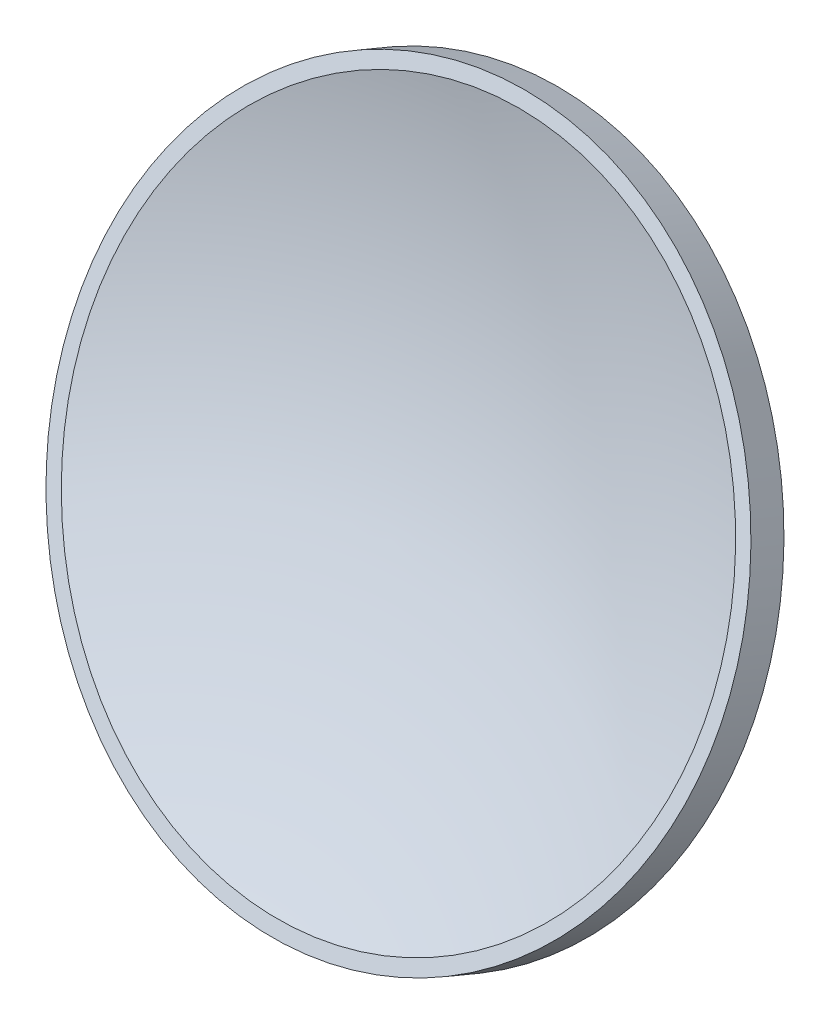
ISO-10303-21;
HEADER;
FILE_DESCRIPTION(('STEP AP214'),'2;1');
FILE_NAME('part.step','',(''),(''),'','','');
FILE_SCHEMA(('AUTOMOTIVE_DESIGN { 1 0 10303 214 1 1 1 1 }'));
ENDSEC;
DATA;
#1=APPLICATION_CONTEXT('core data for automotive mechanical design processes');
#2=APPLICATION_PROTOCOL_DEFINITION('international standard','automotive_design',2000,#1);
#3=PRODUCT_CONTEXT('',#1,'mechanical');
#4=PRODUCT('Part','Part','',(#3));
#5=PRODUCT_RELATED_PRODUCT_CATEGORY('part','',(#4));
#6=PRODUCT_DEFINITION_FORMATION('','',#4);
#7=PRODUCT_DEFINITION_CONTEXT('part definition',#1,'design');
#8=PRODUCT_DEFINITION('design','',#6,#7);
#9=PRODUCT_DEFINITION_SHAPE('','',#8);
#10=(LENGTH_UNIT() NAMED_UNIT(*) SI_UNIT(.MILLI.,.METRE.));
#11=(NAMED_UNIT(*) PLANE_ANGLE_UNIT() SI_UNIT($,.RADIAN.));
#12=(NAMED_UNIT(*) SI_UNIT($,.STERADIAN.) SOLID_ANGLE_UNIT());
#13=UNCERTAINTY_MEASURE_WITH_UNIT(LENGTH_MEASURE(1.E-05),#10,'distance_accuracy_value','');
#14=(GEOMETRIC_REPRESENTATION_CONTEXT(3) GLOBAL_UNCERTAINTY_ASSIGNED_CONTEXT((#13)) GLOBAL_UNIT_ASSIGNED_CONTEXT((#10,
#11,#12)) REPRESENTATION_CONTEXT('',''));
#15=CARTESIAN_POINT('',(0.,0.,0.));
#16=DIRECTION('',(0.,0.,1.));
#17=DIRECTION('',(1.,0.,0.));
#18=AXIS2_PLACEMENT_3D('',#15,#16,#17);
#19=CARTESIAN_POINT('',(0.,44.6288579944449,111.403038880774));
#20=DIRECTION('',(0.,-0.383758970930003,-0.923433296037535));
#21=DIRECTION('',(1.,0.,0.));
#22=AXIS2_PLACEMENT_3D('',#19,#20,#21);
#23=SPHERICAL_SURFACE('',#22,114.344237552241);
#24=CARTESIAN_POINT('',(0.,4.12716361070269,13.9444360258432));
#25=DIRECTION('',(0.,-0.383758970930003,-0.923433296037535));
#26=DIRECTION('',(0.,0.923433296037535,-0.383758970930003));
#27=AXIS2_PLACEMENT_3D('',#24,#25,#26);
#28=CIRCLE('',#27,44.0004334412091);
#29=CARTESIAN_POINT('',(0.,44.7586288903986,-2.94112503202928));
#30=VERTEX_POINT('',#29);
#31=EDGE_CURVE('E10',#30,#30,#28,.T.);
#32=ORIENTED_EDGE('',*,*,#31,.F.);
#33=EDGE_LOOP('',(#32));
#34=FACE_BOUND('',#33,.T.);
#35=ADVANCED_FACE('F28',(#34),#23,.F.);
#36=CARTESIAN_POINT('',(44.0004334412091,4.12716361070269,13.9444360258432));
#37=DIRECTION('',(0.,0.383758970930003,0.923433296037535));
#38=DIRECTION('',(0.,-0.923433296037535,0.383758970930003));
#39=AXIS2_PLACEMENT_3D('',#36,#37,#38);
#40=PLANE('',#39);
#41=ORIENTED_EDGE('',*,*,#31,.T.);
#42=EDGE_LOOP('',(#41));
#43=FACE_BOUND('',#42,.T.);
#44=CARTESIAN_POINT('',(0.,4.12716361070269,13.9444360258432));
#45=DIRECTION('',(0.,-0.383758970930003,-0.923433296037535));
#46=DIRECTION('',(0.,0.923433296037535,-0.383758970930003));
#47=AXIS2_PLACEMENT_3D('',#44,#45,#46);
#48=CIRCLE('',#47,46.);
#49=CARTESIAN_POINT('',(0.,46.6050952284293,-3.70847663693693));
#50=VERTEX_POINT('',#49);
#51=EDGE_CURVE('E34',#50,#50,#48,.T.);
#52=ORIENTED_EDGE('',*,*,#51,.F.);
#53=EDGE_LOOP('',(#52));
#54=FACE_BOUND('',#53,.T.);
#55=ADVANCED_FACE('F60',(#43,#54),#40,.T.);
#56=CARTESIAN_POINT('',(0.,44.6288579944449,111.403038880774));
#57=DIRECTION('',(0.,-0.383758970930003,-0.923433296037535));
#58=DIRECTION('',(0.,0.923433296037535,-0.383758970930003));
#59=AXIS2_PLACEMENT_3D('',#56,#57,#58);
#60=CYLINDRICAL_SURFACE('',#59,46.);
#61=ORIENTED_EDGE('',*,*,#51,.T.);
#62=EDGE_LOOP('',(#61));
#63=FACE_BOUND('',#62,.T.);
#64=CARTESIAN_POINT('',(0.,2.20836875605267,9.32726954565552));
#65=DIRECTION('',(0.,-0.383758970930003,-0.923433296037535));
#66=DIRECTION('',(0.,0.923433296037535,-0.383758970930003));
#67=AXIS2_PLACEMENT_3D('',#64,#65,#66);
#68=CIRCLE('',#67,46.);
#69=CARTESIAN_POINT('',(0.,44.6863003737793,-8.32564311712461));
#70=VERTEX_POINT('',#69);
#71=EDGE_CURVE('E38',#70,#70,#68,.T.);
#72=ORIENTED_EDGE('',*,*,#71,.F.);
#73=EDGE_LOOP('',(#72));
#74=FACE_BOUND('',#73,.T.);
#75=ADVANCED_FACE('F52',(#63,#74),#60,.T.);
#76=CARTESIAN_POINT('',(0.,2.01648927058767,8.86555289763676));
#77=DIRECTION('',(0.,0.383758970930003,0.923433296037535));
#78=DIRECTION('',(0.,-0.923433296037535,0.383758970930003));
#79=AXIS2_PLACEMENT_3D('',#76,#77,#78);
#80=CONICAL_SURFACE('',#79,45.5,0.785398163397438);
#81=ORIENTED_EDGE('',*,*,#71,.T.);
#82=EDGE_LOOP('',(#81));
#83=FACE_BOUND('',#82,.T.);
#84=CARTESIAN_POINT('',(0.,2.01648927058767,8.86555289763676));
#85=DIRECTION('',(0.,-0.383758970930003,-0.923433296037535));
#86=DIRECTION('',(0.,0.923433296037535,-0.383758970930003));
#87=AXIS2_PLACEMENT_3D('',#84,#85,#86);
#88=CIRCLE('',#87,45.5);
#89=CARTESIAN_POINT('',(0.,44.0327042402955,-8.59548027967837));
#90=VERTEX_POINT('',#89);
#91=EDGE_CURVE('E42',#90,#90,#88,.T.);
#92=ORIENTED_EDGE('',*,*,#91,.F.);
#93=EDGE_LOOP('',(#92));
#94=FACE_BOUND('',#93,.T.);
#95=ADVANCED_FACE('F50',(#83,#94),#80,.T.);
#96=CARTESIAN_POINT('',(0.,44.6288579944449,111.403038880774));
#97=DIRECTION('',(0.,-0.383758970930003,-0.923433296037535));
#98=DIRECTION('',(1.,0.,0.));
#99=AXIS2_PLACEMENT_3D('',#96,#97,#98);
#100=SPHERICAL_SURFACE('',#99,120.);
#101=ORIENTED_EDGE('',*,*,#91,.T.);
#102=EDGE_LOOP('',(#101));
#103=FACE_BOUND('',#102,.T.);
#104=ADVANCED_FACE('F48',(#103),#100,.T.);
#105=CLOSED_SHELL('',(#35,#55,#75,#95,#104));
#106=MANIFOLD_SOLID_BREP('B2',#105);
#107=ADVANCED_BREP_SHAPE_REPRESENTATION('',(#18,#106),#14);
#108=SHAPE_DEFINITION_REPRESENTATION(#9,#107);
ENDSEC;
END-ISO-10303-21;
